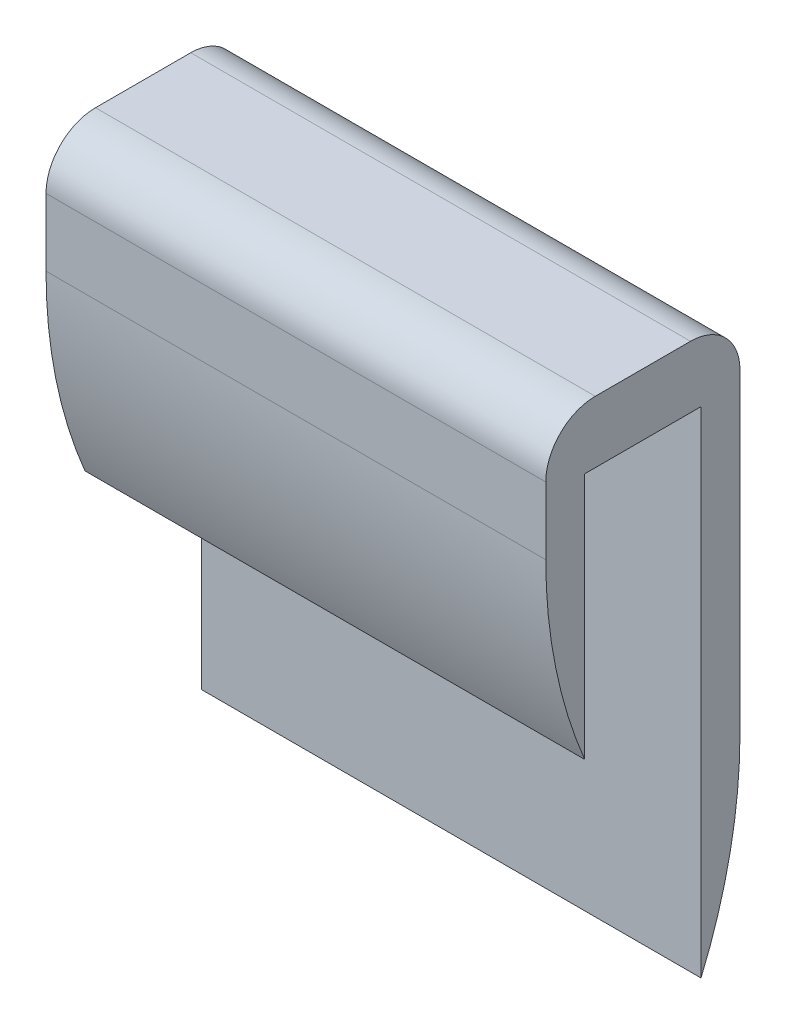
ISO-10303-21;
HEADER;
FILE_DESCRIPTION(('STEP AP214'),'2;1');
FILE_NAME('part.step','',(''),(''),'','','');
FILE_SCHEMA(('AUTOMOTIVE_DESIGN { 1 0 10303 214 1 1 1 1 }'));
ENDSEC;
DATA;
#1=APPLICATION_CONTEXT('core data for automotive mechanical design processes');
#2=APPLICATION_PROTOCOL_DEFINITION('international standard','automotive_design',2000,#1);
#3=PRODUCT_CONTEXT('',#1,'mechanical');
#4=PRODUCT('Part','Part','',(#3));
#5=PRODUCT_RELATED_PRODUCT_CATEGORY('part','',(#4));
#6=PRODUCT_DEFINITION_FORMATION('','',#4);
#7=PRODUCT_DEFINITION_CONTEXT('part definition',#1,'design');
#8=PRODUCT_DEFINITION('design','',#6,#7);
#9=PRODUCT_DEFINITION_SHAPE('','',#8);
#10=(LENGTH_UNIT() NAMED_UNIT(*) SI_UNIT(.MILLI.,.METRE.));
#11=(NAMED_UNIT(*) PLANE_ANGLE_UNIT() SI_UNIT($,.RADIAN.));
#12=(NAMED_UNIT(*) SI_UNIT($,.STERADIAN.) SOLID_ANGLE_UNIT());
#13=UNCERTAINTY_MEASURE_WITH_UNIT(LENGTH_MEASURE(1.E-05),#10,'distance_accuracy_value','');
#14=(GEOMETRIC_REPRESENTATION_CONTEXT(3) GLOBAL_UNCERTAINTY_ASSIGNED_CONTEXT((#13)) GLOBAL_UNIT_ASSIGNED_CONTEXT((#10,
#11,#12)) REPRESENTATION_CONTEXT('',''));
#15=CARTESIAN_POINT('',(0.,0.,0.));
#16=DIRECTION('',(0.,0.,1.));
#17=DIRECTION('',(1.,0.,0.));
#18=AXIS2_PLACEMENT_3D('',#15,#16,#17);
#19=CARTESIAN_POINT('',(25.654,3.175,4.9845));
#20=DIRECTION('',(0.,0.,-1.));
#21=DIRECTION('',(0.,1.,0.));
#22=AXIS2_PLACEMENT_3D('',#19,#20,#21);
#23=PLANE('',#22);
#24=DIRECTION('',(0.,-1.,0.));
#25=VECTOR('',#24,1.);
#26=CARTESIAN_POINT('',(25.654,3.175,4.9845));
#27=LINE('',#26,#25);
#28=CARTESIAN_POINT('',(25.654,0.634999999999998,4.9845));
#29=VERTEX_POINT('',#28);
#30=CARTESIAN_POINT('',(25.654,-2.82072877181723,4.9845));
#31=VERTEX_POINT('',#30);
#32=EDGE_CURVE('E117',#29,#31,#27,.T.);
#33=ORIENTED_EDGE('',*,*,#32,.F.);
#34=DIRECTION('',(-1.,0.,0.));
#35=VECTOR('',#34,1.);
#36=CARTESIAN_POINT('',(25.654,0.634999999999998,4.9845));
#37=LINE('',#36,#35);
#38=CARTESIAN_POINT('',(0.,0.634999999999998,4.9845));
#39=VERTEX_POINT('',#38);
#40=EDGE_CURVE('E11',#29,#39,#37,.T.);
#41=ORIENTED_EDGE('',*,*,#40,.T.);
#42=DIRECTION('',(0.,-1.,0.));
#43=VECTOR('',#42,1.);
#44=CARTESIAN_POINT('',(0.,3.175,4.9845));
#45=LINE('',#44,#43);
#46=CARTESIAN_POINT('',(0.,-2.82072877181723,4.9845));
#47=VERTEX_POINT('',#46);
#48=EDGE_CURVE('E208',#39,#47,#45,.T.);
#49=ORIENTED_EDGE('',*,*,#48,.T.);
#50=DIRECTION('',(1.,0.,0.));
#51=VECTOR('',#50,1.);
#52=CARTESIAN_POINT('',(25.654,-2.82072877181723,4.9845));
#53=LINE('',#52,#51);
#54=EDGE_CURVE('E146',#47,#31,#53,.T.);
#55=ORIENTED_EDGE('',*,*,#54,.T.);
#56=EDGE_LOOP('',(#33,#41,#49,#55));
#57=FACE_BOUND('',#56,.T.);
#58=ADVANCED_FACE('F34',(#57),#23,.F.);
#59=CARTESIAN_POINT('',(25.654,-12.7,2.9845));
#60=DIRECTION('',(0.,0.,1.));
#61=DIRECTION('',(1.,0.,0.));
#62=AXIS2_PLACEMENT_3D('',#59,#60,#61);
#63=PLANE('',#62);
#64=DIRECTION('',(0.,1.,0.));
#65=VECTOR('',#64,1.);
#66=CARTESIAN_POINT('',(0.,-12.7,2.9845));
#67=LINE('',#66,#65);
#68=CARTESIAN_POINT('',(0.,-12.7,2.9845));
#69=VERTEX_POINT('',#68);
#70=CARTESIAN_POINT('',(0.,0.,2.9845));
#71=VERTEX_POINT('',#70);
#72=EDGE_CURVE('E210',#69,#71,#67,.T.);
#73=ORIENTED_EDGE('',*,*,#72,.T.);
#74=DIRECTION('',(-1.,0.,0.));
#75=VECTOR('',#74,1.);
#76=CARTESIAN_POINT('',(25.654,0.,2.9845));
#77=LINE('',#76,#75);
#78=CARTESIAN_POINT('',(25.654,0.,2.9845));
#79=VERTEX_POINT('',#78);
#80=EDGE_CURVE('E131',#79,#71,#77,.T.);
#81=ORIENTED_EDGE('',*,*,#80,.F.);
#82=DIRECTION('',(0.,1.,0.));
#83=VECTOR('',#82,1.);
#84=CARTESIAN_POINT('',(25.654,-12.7,2.9845));
#85=LINE('',#84,#83);
#86=CARTESIAN_POINT('',(25.654,-12.7,2.9845));
#87=VERTEX_POINT('',#86);
#88=EDGE_CURVE('E115',#87,#79,#85,.T.);
#89=ORIENTED_EDGE('',*,*,#88,.F.);
#90=DIRECTION('',(-1.,0.,0.));
#91=VECTOR('',#90,1.);
#92=CARTESIAN_POINT('',(25.654,-12.7,2.9845));
#93=LINE('',#92,#91);
#94=EDGE_CURVE('E128',#87,#69,#93,.T.);
#95=ORIENTED_EDGE('',*,*,#94,.T.);
#96=EDGE_LOOP('',(#73,#81,#89,#95));
#97=FACE_BOUND('',#96,.T.);
#98=ADVANCED_FACE('F127',(#97),#63,.F.);
#99=CARTESIAN_POINT('',(25.654,0.,2.9845));
#100=DIRECTION('',(0.,1.,0.));
#101=DIRECTION('',(0.,0.,1.));
#102=AXIS2_PLACEMENT_3D('',#99,#100,#101);
#103=PLANE('',#102);
#104=DIRECTION('',(0.,0.,-1.));
#105=VECTOR('',#104,1.);
#106=CARTESIAN_POINT('',(0.,0.,2.9845));
#107=LINE('',#106,#105);
#108=CARTESIAN_POINT('',(0.,0.,-2.9845));
#109=VERTEX_POINT('',#108);
#110=EDGE_CURVE('E186',#71,#109,#107,.T.);
#111=ORIENTED_EDGE('',*,*,#110,.T.);
#112=DIRECTION('',(-1.,0.,0.));
#113=VECTOR('',#112,1.);
#114=CARTESIAN_POINT('',(25.654,0.,-2.9845));
#115=LINE('',#114,#113);
#116=CARTESIAN_POINT('',(25.654,0.,-2.9845));
#117=VERTEX_POINT('',#116);
#118=EDGE_CURVE('E141',#117,#109,#115,.T.);
#119=ORIENTED_EDGE('',*,*,#118,.F.);
#120=DIRECTION('',(0.,0.,-1.));
#121=VECTOR('',#120,1.);
#122=CARTESIAN_POINT('',(25.654,0.,2.9845));
#123=LINE('',#122,#121);
#124=EDGE_CURVE('E133',#79,#117,#123,.T.);
#125=ORIENTED_EDGE('',*,*,#124,.F.);
#126=ORIENTED_EDGE('',*,*,#80,.T.);
#127=EDGE_LOOP('',(#111,#119,#125,#126));
#128=FACE_BOUND('',#127,.T.);
#129=ADVANCED_FACE('F211',(#128),#103,.F.);
#130=CARTESIAN_POINT('',(25.654,0.,-2.9845));
#131=DIRECTION('',(0.,0.,-1.));
#132=DIRECTION('',(0.,1.,0.));
#133=AXIS2_PLACEMENT_3D('',#130,#131,#132);
#134=PLANE('',#133);
#135=DIRECTION('',(0.,-1.,0.));
#136=VECTOR('',#135,1.);
#137=CARTESIAN_POINT('',(0.,0.,-2.9845));
#138=LINE('',#137,#136);
#139=CARTESIAN_POINT('',(0.,-25.4,-2.9845));
#140=VERTEX_POINT('',#139);
#141=EDGE_CURVE('E182',#109,#140,#138,.T.);
#142=ORIENTED_EDGE('',*,*,#141,.T.);
#143=DIRECTION('',(-1.,0.,0.));
#144=VECTOR('',#143,1.);
#145=CARTESIAN_POINT('',(25.654,-25.4,-2.9845));
#146=LINE('',#145,#144);
#147=CARTESIAN_POINT('',(25.654,-25.4,-2.9845));
#148=VERTEX_POINT('',#147);
#149=EDGE_CURVE('E172',#148,#140,#146,.T.);
#150=ORIENTED_EDGE('',*,*,#149,.F.);
#151=DIRECTION('',(0.,-1.,0.));
#152=VECTOR('',#151,1.);
#153=CARTESIAN_POINT('',(25.654,0.,-2.9845));
#154=LINE('',#153,#152);
#155=EDGE_CURVE('E198',#117,#148,#154,.T.);
#156=ORIENTED_EDGE('',*,*,#155,.F.);
#157=ORIENTED_EDGE('',*,*,#118,.T.);
#158=EDGE_LOOP('',(#142,#150,#156,#157));
#159=FACE_BOUND('',#158,.T.);
#160=ADVANCED_FACE('F196',(#159),#134,.F.);
#161=CARTESIAN_POINT('',(25.654,-25.4,-4.9845));
#162=DIRECTION('',(0.,0.,1.));
#163=DIRECTION('',(1.,0.,0.));
#164=AXIS2_PLACEMENT_3D('',#161,#162,#163);
#165=PLANE('',#164);
#166=DIRECTION('',(0.,1.,0.));
#167=VECTOR('',#166,1.);
#168=CARTESIAN_POINT('',(0.,-25.4,-4.9845));
#169=LINE('',#168,#167);
#170=CARTESIAN_POINT('',(0.,-15.5207287718172,-4.9845));
#171=VERTEX_POINT('',#170);
#172=CARTESIAN_POINT('',(0.,0.634999999999993,-4.9845));
#173=VERTEX_POINT('',#172);
#174=EDGE_CURVE('E178',#171,#173,#169,.T.);
#175=ORIENTED_EDGE('',*,*,#174,.T.);
#176=DIRECTION('',(-1.,0.,0.));
#177=VECTOR('',#176,1.);
#178=CARTESIAN_POINT('',(25.654,0.635,-4.9845));
#179=LINE('',#178,#177);
#180=CARTESIAN_POINT('',(25.654,0.634999999999993,-4.9845));
#181=VERTEX_POINT('',#180);
#182=EDGE_CURVE('E57',#173,#181,#179,.F.);
#183=ORIENTED_EDGE('',*,*,#182,.T.);
#184=DIRECTION('',(0.,1.,0.));
#185=VECTOR('',#184,1.);
#186=CARTESIAN_POINT('',(25.654,-25.4,-4.9845));
#187=LINE('',#186,#185);
#188=CARTESIAN_POINT('',(25.654,-15.5207287718172,-4.9845));
#189=VERTEX_POINT('',#188);
#190=EDGE_CURVE('E164',#189,#181,#187,.T.);
#191=ORIENTED_EDGE('',*,*,#190,.F.);
#192=DIRECTION('',(-1.,0.,0.));
#193=VECTOR('',#192,1.);
#194=CARTESIAN_POINT('',(25.654,-15.5207287718172,-4.9845));
#195=LINE('',#194,#193);
#196=EDGE_CURVE('E122',#189,#171,#195,.T.);
#197=ORIENTED_EDGE('',*,*,#196,.T.);
#198=EDGE_LOOP('',(#175,#183,#191,#197));
#199=FACE_BOUND('',#198,.T.);
#200=ADVANCED_FACE('F180',(#199),#165,.F.);
#201=CARTESIAN_POINT('',(25.654,3.175,-4.9845));
#202=DIRECTION('',(0.,-1.,0.));
#203=DIRECTION('',(0.,0.,-1.));
#204=AXIS2_PLACEMENT_3D('',#201,#202,#203);
#205=PLANE('',#204);
#206=DIRECTION('',(0.,0.,1.));
#207=VECTOR('',#206,1.);
#208=CARTESIAN_POINT('',(25.654,3.175,-4.9845));
#209=LINE('',#208,#207);
#210=CARTESIAN_POINT('',(25.654,3.175,-2.4445));
#211=VERTEX_POINT('',#210);
#212=CARTESIAN_POINT('',(25.654,3.175,2.4445));
#213=VERTEX_POINT('',#212);
#214=EDGE_CURVE('E163',#211,#213,#209,.T.);
#215=ORIENTED_EDGE('',*,*,#214,.F.);
#216=DIRECTION('',(-1.,0.,0.));
#217=VECTOR('',#216,1.);
#218=CARTESIAN_POINT('',(25.654,3.175,-2.4445));
#219=LINE('',#218,#217);
#220=CARTESIAN_POINT('',(0.,3.175,-2.4445));
#221=VERTEX_POINT('',#220);
#222=EDGE_CURVE('E153',#211,#221,#219,.T.);
#223=ORIENTED_EDGE('',*,*,#222,.T.);
#224=DIRECTION('',(0.,0.,1.));
#225=VECTOR('',#224,1.);
#226=CARTESIAN_POINT('',(0.,3.175,-4.9845));
#227=LINE('',#226,#225);
#228=CARTESIAN_POINT('',(0.,3.175,2.4445));
#229=VERTEX_POINT('',#228);
#230=EDGE_CURVE('E179',#221,#229,#227,.T.);
#231=ORIENTED_EDGE('',*,*,#230,.T.);
#232=DIRECTION('',(-1.,0.,0.));
#233=VECTOR('',#232,1.);
#234=CARTESIAN_POINT('',(25.654,3.175,2.4445));
#235=LINE('',#234,#233);
#236=EDGE_CURVE('E151',#229,#213,#235,.F.);
#237=ORIENTED_EDGE('',*,*,#236,.T.);
#238=EDGE_LOOP('',(#215,#223,#231,#237));
#239=FACE_BOUND('',#238,.T.);
#240=ADVANCED_FACE('F168',(#239),#205,.F.);
#241=CARTESIAN_POINT('',(25.654,0.,0.));
#242=DIRECTION('',(1.,0.,0.));
#243=DIRECTION('',(0.,0.,-1.));
#244=AXIS2_PLACEMENT_3D('',#241,#242,#243);
#245=PLANE('',#244);
#246=ORIENTED_EDGE('',*,*,#190,.T.);
#247=CARTESIAN_POINT('',(25.654,0.635,-2.4445));
#248=DIRECTION('',(1.,0.,0.));
#249=DIRECTION('',(0.,0.,-1.));
#250=AXIS2_PLACEMENT_3D('',#247,#248,#249);
#251=CIRCLE('',#250,2.54);
#252=EDGE_CURVE('E42',#181,#211,#251,.T.);
#253=ORIENTED_EDGE('',*,*,#252,.T.);
#254=ORIENTED_EDGE('',*,*,#214,.T.);
#255=CARTESIAN_POINT('',(25.654,0.634999999999999,2.4445));
#256=DIRECTION('',(1.,0.,0.));
#257=DIRECTION('',(0.,0.,-1.));
#258=AXIS2_PLACEMENT_3D('',#255,#256,#257);
#259=CIRCLE('',#258,2.54);
#260=EDGE_CURVE('E49',#213,#29,#259,.T.);
#261=ORIENTED_EDGE('',*,*,#260,.T.);
#262=ORIENTED_EDGE('',*,*,#32,.T.);
#263=CARTESIAN_POINT('',(25.654,-2.82072877181722,-20.4155));
#264=DIRECTION('',(1.,0.,0.));
#265=DIRECTION('',(0.,0.,-1.));
#266=AXIS2_PLACEMENT_3D('',#263,#264,#265);
#267=CIRCLE('',#266,25.4);
#268=EDGE_CURVE('E112',#31,#87,#267,.T.);
#269=ORIENTED_EDGE('',*,*,#268,.T.);
#270=ORIENTED_EDGE('',*,*,#88,.T.);
#271=ORIENTED_EDGE('',*,*,#124,.T.);
#272=ORIENTED_EDGE('',*,*,#155,.T.);
#273=CARTESIAN_POINT('',(25.654,-15.5207287718172,20.4155));
#274=DIRECTION('',(1.,0.,0.));
#275=DIRECTION('',(0.,0.,-1.));
#276=AXIS2_PLACEMENT_3D('',#273,#274,#275);
#277=CIRCLE('',#276,25.4);
#278=EDGE_CURVE('E123',#148,#189,#277,.T.);
#279=ORIENTED_EDGE('',*,*,#278,.T.);
#280=EDGE_LOOP('',(#246,#253,#254,#261,#262,#269,#270,#271,#272,#279));
#281=FACE_BOUND('',#280,.T.);
#282=ADVANCED_FACE('F114',(#281),#245,.T.);
#283=CARTESIAN_POINT('',(0.,0.,0.));
#284=DIRECTION('',(1.,0.,0.));
#285=DIRECTION('',(0.,0.,-1.));
#286=AXIS2_PLACEMENT_3D('',#283,#284,#285);
#287=PLANE('',#286);
#288=ORIENTED_EDGE('',*,*,#230,.F.);
#289=CARTESIAN_POINT('',(0.,0.635,-2.4445));
#290=DIRECTION('',(1.,0.,0.));
#291=DIRECTION('',(0.,0.,-1.));
#292=AXIS2_PLACEMENT_3D('',#289,#290,#291);
#293=CIRCLE('',#292,2.54);
#294=EDGE_CURVE('E158',#221,#173,#293,.F.);
#295=ORIENTED_EDGE('',*,*,#294,.T.);
#296=ORIENTED_EDGE('',*,*,#174,.F.);
#297=CARTESIAN_POINT('',(0.,-15.5207287718172,20.4155));
#298=DIRECTION('',(1.,0.,0.));
#299=DIRECTION('',(0.,0.,-1.));
#300=AXIS2_PLACEMENT_3D('',#297,#298,#299);
#301=CIRCLE('',#300,25.4);
#302=EDGE_CURVE('E138',#171,#140,#301,.F.);
#303=ORIENTED_EDGE('',*,*,#302,.T.);
#304=ORIENTED_EDGE('',*,*,#141,.F.);
#305=ORIENTED_EDGE('',*,*,#110,.F.);
#306=ORIENTED_EDGE('',*,*,#72,.F.);
#307=CARTESIAN_POINT('',(0.,-2.82072877181722,-20.4155));
#308=DIRECTION('',(1.,0.,0.));
#309=DIRECTION('',(0.,0.,-1.));
#310=AXIS2_PLACEMENT_3D('',#307,#308,#309);
#311=CIRCLE('',#310,25.4);
#312=EDGE_CURVE('E137',#69,#47,#311,.F.);
#313=ORIENTED_EDGE('',*,*,#312,.T.);
#314=ORIENTED_EDGE('',*,*,#48,.F.);
#315=CARTESIAN_POINT('',(0.,0.634999999999999,2.4445));
#316=DIRECTION('',(1.,0.,0.));
#317=DIRECTION('',(0.,0.,-1.));
#318=AXIS2_PLACEMENT_3D('',#315,#316,#317);
#319=CIRCLE('',#318,2.54);
#320=EDGE_CURVE('E156',#39,#229,#319,.F.);
#321=ORIENTED_EDGE('',*,*,#320,.T.);
#322=EDGE_LOOP('',(#288,#295,#296,#303,#304,#305,#306,#313,#314,#321));
#323=FACE_BOUND('',#322,.T.);
#324=ADVANCED_FACE('F177',(#323),#287,.F.);
#325=CARTESIAN_POINT('',(25.654,-2.82072877181722,-20.4155));
#326=DIRECTION('',(1.,0.,0.));
#327=DIRECTION('',(0.,0.,-1.));
#328=AXIS2_PLACEMENT_3D('',#325,#326,#327);
#329=CYLINDRICAL_SURFACE('',#328,25.4);
#330=ORIENTED_EDGE('',*,*,#268,.F.);
#331=ORIENTED_EDGE('',*,*,#54,.F.);
#332=ORIENTED_EDGE('',*,*,#312,.F.);
#333=ORIENTED_EDGE('',*,*,#94,.F.);
#334=EDGE_LOOP('',(#330,#331,#332,#333));
#335=FACE_BOUND('',#334,.T.);
#336=ADVANCED_FACE('F135',(#335),#329,.T.);
#337=CARTESIAN_POINT('',(25.654,-15.5207287718172,20.4155));
#338=DIRECTION('',(-1.,0.,0.));
#339=DIRECTION('',(0.,0.,1.));
#340=AXIS2_PLACEMENT_3D('',#337,#338,#339);
#341=CYLINDRICAL_SURFACE('',#340,25.4);
#342=ORIENTED_EDGE('',*,*,#278,.F.);
#343=ORIENTED_EDGE('',*,*,#149,.T.);
#344=ORIENTED_EDGE('',*,*,#302,.F.);
#345=ORIENTED_EDGE('',*,*,#196,.F.);
#346=EDGE_LOOP('',(#342,#343,#344,#345));
#347=FACE_BOUND('',#346,.T.);
#348=ADVANCED_FACE('F203',(#347),#341,.T.);
#349=CARTESIAN_POINT('',(25.654,0.635,-2.4445));
#350=DIRECTION('',(-1.,0.,0.));
#351=DIRECTION('',(0.,0.,1.));
#352=AXIS2_PLACEMENT_3D('',#349,#350,#351);
#353=CYLINDRICAL_SURFACE('',#352,2.54);
#354=ORIENTED_EDGE('',*,*,#252,.F.);
#355=ORIENTED_EDGE('',*,*,#182,.F.);
#356=ORIENTED_EDGE('',*,*,#294,.F.);
#357=ORIENTED_EDGE('',*,*,#222,.F.);
#358=EDGE_LOOP('',(#354,#355,#356,#357));
#359=FACE_BOUND('',#358,.T.);
#360=ADVANCED_FACE('F174',(#359),#353,.T.);
#361=CARTESIAN_POINT('',(25.654,0.634999999999999,2.4445));
#362=DIRECTION('',(-1.,0.,0.));
#363=DIRECTION('',(0.,0.,1.));
#364=AXIS2_PLACEMENT_3D('',#361,#362,#363);
#365=CYLINDRICAL_SURFACE('',#364,2.54);
#366=ORIENTED_EDGE('',*,*,#260,.F.);
#367=ORIENTED_EDGE('',*,*,#236,.F.);
#368=ORIENTED_EDGE('',*,*,#320,.F.);
#369=ORIENTED_EDGE('',*,*,#40,.F.);
#370=EDGE_LOOP('',(#366,#367,#368,#369));
#371=FACE_BOUND('',#370,.T.);
#372=ADVANCED_FACE('F36',(#371),#365,.T.);
#373=CLOSED_SHELL('',(#58,#98,#129,#160,#200,#240,#282,#324,#336,#348,#360,#372));
#374=MANIFOLD_SOLID_BREP('B2',#373);
#375=ADVANCED_BREP_SHAPE_REPRESENTATION('',(#18,#374),#14);
#376=SHAPE_DEFINITION_REPRESENTATION(#9,#375);
ENDSEC;
END-ISO-10303-21;
